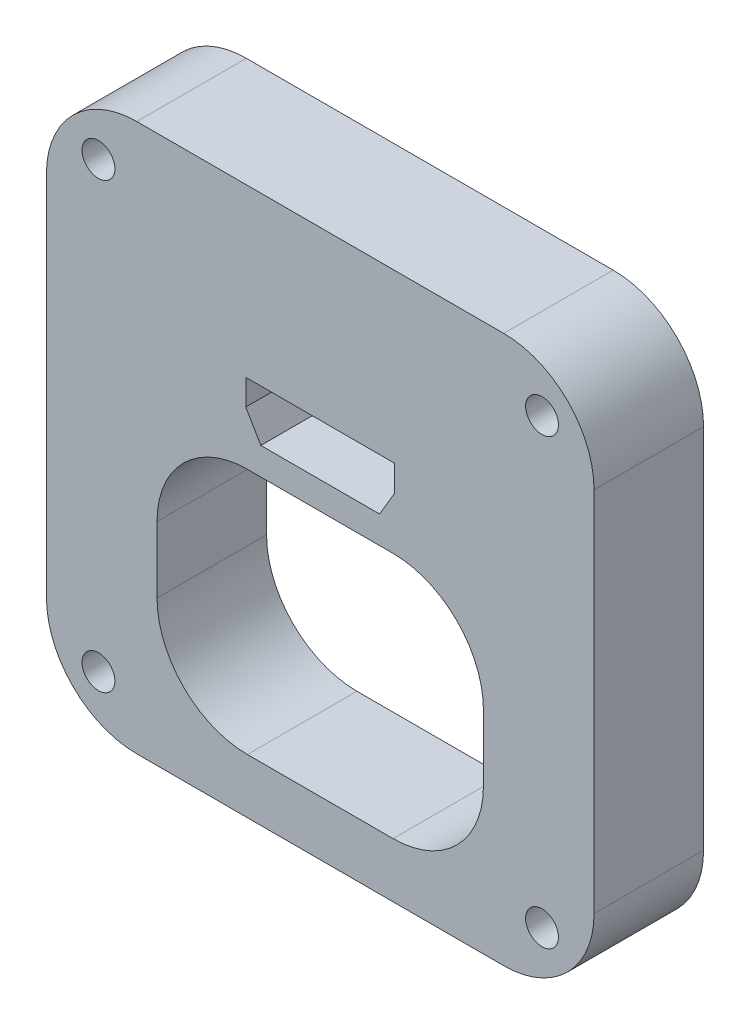
ISO-10303-21;
HEADER;
FILE_DESCRIPTION(('STEP AP214'),'2;1');
FILE_NAME('part.step','',(''),(''),'','','');
FILE_SCHEMA(('AUTOMOTIVE_DESIGN { 1 0 10303 214 1 1 1 1 }'));
ENDSEC;
DATA;
#1=APPLICATION_CONTEXT('core data for automotive mechanical design processes');
#2=APPLICATION_PROTOCOL_DEFINITION('international standard','automotive_design',2000,#1);
#3=PRODUCT_CONTEXT('',#1,'mechanical');
#4=PRODUCT('Part','Part','',(#3));
#5=PRODUCT_RELATED_PRODUCT_CATEGORY('part','',(#4));
#6=PRODUCT_DEFINITION_FORMATION('','',#4);
#7=PRODUCT_DEFINITION_CONTEXT('part definition',#1,'design');
#8=PRODUCT_DEFINITION('design','',#6,#7);
#9=PRODUCT_DEFINITION_SHAPE('','',#8);
#10=(LENGTH_UNIT() NAMED_UNIT(*) SI_UNIT(.MILLI.,.METRE.));
#11=(NAMED_UNIT(*) PLANE_ANGLE_UNIT() SI_UNIT($,.RADIAN.));
#12=(NAMED_UNIT(*) SI_UNIT($,.STERADIAN.) SOLID_ANGLE_UNIT());
#13=UNCERTAINTY_MEASURE_WITH_UNIT(LENGTH_MEASURE(1.E-05),#10,'distance_accuracy_value','');
#14=(GEOMETRIC_REPRESENTATION_CONTEXT(3) GLOBAL_UNCERTAINTY_ASSIGNED_CONTEXT((#13)) GLOBAL_UNIT_ASSIGNED_CONTEXT((#10,
#11,#12)) REPRESENTATION_CONTEXT('',''));
#15=CARTESIAN_POINT('',(0.,0.,0.));
#16=DIRECTION('',(0.,0.,1.));
#17=DIRECTION('',(1.,0.,0.));
#18=AXIS2_PLACEMENT_3D('',#15,#16,#17);
#19=CARTESIAN_POINT('',(8.509,8.509,5.08));
#20=DIRECTION('',(0.,0.,-1.));
#21=DIRECTION('',(-1.,0.,0.));
#22=AXIS2_PLACEMENT_3D('',#19,#20,#21);
#23=PLANE('',#22);
#24=CARTESIAN_POINT('',(10.287,10.287,5.08));
#25=DIRECTION('',(0.,0.,-1.));
#26=DIRECTION('',(-1.,0.,0.));
#27=AXIS2_PLACEMENT_3D('',#24,#25,#26);
#28=CIRCLE('',#27,0.762000000000001);
#29=CARTESIAN_POINT('',(9.52499999999997,10.287,5.08));
#30=VERTEX_POINT('',#29);
#31=EDGE_CURVE('E684',#30,#30,#28,.T.);
#32=ORIENTED_EDGE('',*,*,#31,.T.);
#33=EDGE_LOOP('',(#32));
#34=FACE_BOUND('',#33,.T.);
#35=CARTESIAN_POINT('',(-10.287,-10.287,5.08));
#36=DIRECTION('',(0.,0.,-1.));
#37=DIRECTION('',(-1.,0.,0.));
#38=AXIS2_PLACEMENT_3D('',#35,#36,#37);
#39=CIRCLE('',#38,0.762000000000001);
#40=CARTESIAN_POINT('',(-11.049,-10.287,5.08));
#41=VERTEX_POINT('',#40);
#42=EDGE_CURVE('E299',#41,#41,#39,.T.);
#43=ORIENTED_EDGE('',*,*,#42,.T.);
#44=EDGE_LOOP('',(#43));
#45=FACE_BOUND('',#44,.T.);
#46=DIRECTION('',(1.,0.,0.));
#47=VECTOR('',#46,1.);
#48=CARTESIAN_POINT('',(0.,4.953,5.08));
#49=LINE('',#48,#47);
#50=CARTESIAN_POINT('',(-3.4544,4.953,5.08));
#51=VERTEX_POINT('',#50);
#52=CARTESIAN_POINT('',(3.4544,4.953,5.08));
#53=VERTEX_POINT('',#52);
#54=EDGE_CURVE('E200',#51,#53,#49,.T.);
#55=ORIENTED_EDGE('',*,*,#54,.T.);
#56=DIRECTION('',(0.,-1.,0.));
#57=VECTOR('',#56,1.);
#58=CARTESIAN_POINT('',(3.4544,0.,5.08));
#59=LINE('',#58,#57);
#60=CARTESIAN_POINT('',(3.4544,3.7592,5.08));
#61=VERTEX_POINT('',#60);
#62=EDGE_CURVE('E194',#53,#61,#59,.T.);
#63=ORIENTED_EDGE('',*,*,#62,.T.);
#64=DIRECTION('',(-0.505012393824012,-0.863112091262856,0.));
#65=VECTOR('',#64,1.);
#66=CARTESIAN_POINT('',(0.934829643369024,-0.54697479133294,5.08));
#67=LINE('',#66,#65);
#68=CARTESIAN_POINT('',(2.7559,2.5654,5.08));
#69=VERTEX_POINT('',#68);
#70=EDGE_CURVE('E203',#61,#69,#67,.T.);
#71=ORIENTED_EDGE('',*,*,#70,.T.);
#72=DIRECTION('',(1.,0.,0.));
#73=VECTOR('',#72,1.);
#74=CARTESIAN_POINT('',(0.,2.5654,5.08));
#75=LINE('',#74,#73);
#76=CARTESIAN_POINT('',(-2.7559,2.5654,5.08));
#77=VERTEX_POINT('',#76);
#78=EDGE_CURVE('E208',#77,#69,#75,.T.);
#79=ORIENTED_EDGE('',*,*,#78,.F.);
#80=DIRECTION('',(0.505012393824012,-0.863112091262856,0.));
#81=VECTOR('',#80,1.);
#82=CARTESIAN_POINT('',(-0.934829643369024,-0.54697479133294,5.08));
#83=LINE('',#82,#81);
#84=CARTESIAN_POINT('',(-3.4544,3.7592,5.08));
#85=VERTEX_POINT('',#84);
#86=EDGE_CURVE('E226',#85,#77,#83,.T.);
#87=ORIENTED_EDGE('',*,*,#86,.F.);
#88=DIRECTION('',(0.,-1.,0.));
#89=VECTOR('',#88,1.);
#90=CARTESIAN_POINT('',(-3.4544,0.,5.08));
#91=LINE('',#90,#89);
#92=EDGE_CURVE('E229',#51,#85,#91,.T.);
#93=ORIENTED_EDGE('',*,*,#92,.F.);
#94=EDGE_LOOP('',(#55,#63,#71,#79,#87,#93));
#95=FACE_BOUND('',#94,.T.);
#96=CARTESIAN_POINT('',(8.509,8.509,5.08));
#97=DIRECTION('',(0.,0.,1.));
#98=DIRECTION('',(-1.,0.,0.));
#99=AXIS2_PLACEMENT_3D('',#96,#97,#98);
#100=CIRCLE('',#99,4.191);
#101=CARTESIAN_POINT('',(12.7,8.50899999999997,5.08));
#102=VERTEX_POINT('',#101);
#103=CARTESIAN_POINT('',(8.50899999999997,12.7,5.08));
#104=VERTEX_POINT('',#103);
#105=EDGE_CURVE('E348',#102,#104,#100,.T.);
#106=ORIENTED_EDGE('',*,*,#105,.T.);
#107=DIRECTION('',(-1.,0.,0.));
#108=VECTOR('',#107,1.);
#109=CARTESIAN_POINT('',(-8.50899999999997,12.7,5.08));
#110=LINE('',#109,#108);
#111=CARTESIAN_POINT('',(-8.50899999999997,12.7,5.08));
#112=VERTEX_POINT('',#111);
#113=EDGE_CURVE('E352',#104,#112,#110,.T.);
#114=ORIENTED_EDGE('',*,*,#113,.T.);
#115=CARTESIAN_POINT('',(-8.509,8.509,5.08));
#116=DIRECTION('',(0.,0.,1.));
#117=DIRECTION('',(-1.,0.,0.));
#118=AXIS2_PLACEMENT_3D('',#115,#116,#117);
#119=CIRCLE('',#118,4.191);
#120=CARTESIAN_POINT('',(-12.7,8.50899999999997,5.08));
#121=VERTEX_POINT('',#120);
#122=EDGE_CURVE('E356',#112,#121,#119,.T.);
#123=ORIENTED_EDGE('',*,*,#122,.T.);
#124=DIRECTION('',(0.,-1.,0.));
#125=VECTOR('',#124,1.);
#126=CARTESIAN_POINT('',(-12.7,-8.50899999999997,5.08));
#127=LINE('',#126,#125);
#128=CARTESIAN_POINT('',(-12.7,-8.50899999999997,5.08));
#129=VERTEX_POINT('',#128);
#130=EDGE_CURVE('E359',#121,#129,#127,.T.);
#131=ORIENTED_EDGE('',*,*,#130,.T.);
#132=CARTESIAN_POINT('',(-8.509,-8.509,5.08));
#133=DIRECTION('',(0.,0.,1.));
#134=DIRECTION('',(-1.,0.,0.));
#135=AXIS2_PLACEMENT_3D('',#132,#133,#134);
#136=CIRCLE('',#135,4.191);
#137=CARTESIAN_POINT('',(-8.50899999999997,-12.7,5.08));
#138=VERTEX_POINT('',#137);
#139=EDGE_CURVE('E362',#129,#138,#136,.T.);
#140=ORIENTED_EDGE('',*,*,#139,.T.);
#141=DIRECTION('',(1.,0.,0.));
#142=VECTOR('',#141,1.);
#143=CARTESIAN_POINT('',(-8.50899999999997,-12.7,5.08));
#144=LINE('',#143,#142);
#145=CARTESIAN_POINT('',(8.50899999999997,-12.7,5.08));
#146=VERTEX_POINT('',#145);
#147=EDGE_CURVE('E365',#138,#146,#144,.T.);
#148=ORIENTED_EDGE('',*,*,#147,.T.);
#149=CARTESIAN_POINT('',(8.509,-8.509,5.08));
#150=DIRECTION('',(0.,0.,1.));
#151=DIRECTION('',(-1.,0.,0.));
#152=AXIS2_PLACEMENT_3D('',#149,#150,#151);
#153=CIRCLE('',#152,4.191);
#154=CARTESIAN_POINT('',(12.7,-8.50899999999997,5.08));
#155=VERTEX_POINT('',#154);
#156=EDGE_CURVE('E368',#146,#155,#153,.T.);
#157=ORIENTED_EDGE('',*,*,#156,.T.);
#158=DIRECTION('',(0.,1.,0.));
#159=VECTOR('',#158,1.);
#160=CARTESIAN_POINT('',(12.7,-8.50899999999997,5.08));
#161=LINE('',#160,#159);
#162=EDGE_CURVE('E371',#155,#102,#161,.T.);
#163=ORIENTED_EDGE('',*,*,#162,.T.);
#164=EDGE_LOOP('',(#106,#114,#123,#131,#140,#148,#157,#163));
#165=FACE_BOUND('',#164,.T.);
#166=CARTESIAN_POINT('',(3.3782,-2.8956,5.08));
#167=DIRECTION('',(0.,0.,-1.));
#168=DIRECTION('',(-1.,0.,0.));
#169=AXIS2_PLACEMENT_3D('',#166,#167,#168);
#170=CIRCLE('',#169,4.191);
#171=CARTESIAN_POINT('',(7.5692,-2.89560000000003,5.08));
#172=VERTEX_POINT('',#171);
#173=CARTESIAN_POINT('',(3.37819999999997,1.2954,5.08));
#174=VERTEX_POINT('',#173);
#175=EDGE_CURVE('E266',#172,#174,#170,.F.);
#176=ORIENTED_EDGE('',*,*,#175,.F.);
#177=DIRECTION('',(0.,-1.,0.));
#178=VECTOR('',#177,1.);
#179=CARTESIAN_POINT('',(7.5692,0.,5.08));
#180=LINE('',#179,#178);
#181=CARTESIAN_POINT('',(7.5692,-5.96899999999997,5.08));
#182=VERTEX_POINT('',#181);
#183=EDGE_CURVE('E269',#172,#182,#180,.T.);
#184=ORIENTED_EDGE('',*,*,#183,.T.);
#185=CARTESIAN_POINT('',(3.3782,-5.969,5.08));
#186=DIRECTION('',(0.,0.,-1.));
#187=DIRECTION('',(-1.,0.,0.));
#188=AXIS2_PLACEMENT_3D('',#185,#186,#187);
#189=CIRCLE('',#188,4.191);
#190=CARTESIAN_POINT('',(3.37819999999997,-10.16,5.08));
#191=VERTEX_POINT('',#190);
#192=EDGE_CURVE('E274',#191,#182,#189,.F.);
#193=ORIENTED_EDGE('',*,*,#192,.F.);
#194=DIRECTION('',(1.,0.,0.));
#195=VECTOR('',#194,1.);
#196=CARTESIAN_POINT('',(0.,-10.16,5.08));
#197=LINE('',#196,#195);
#198=CARTESIAN_POINT('',(-3.37819999999997,-10.16,5.08));
#199=VERTEX_POINT('',#198);
#200=EDGE_CURVE('E277',#199,#191,#197,.T.);
#201=ORIENTED_EDGE('',*,*,#200,.F.);
#202=CARTESIAN_POINT('',(-3.3782,-5.969,5.08));
#203=DIRECTION('',(0.,0.,-1.));
#204=DIRECTION('',(-1.,0.,0.));
#205=AXIS2_PLACEMENT_3D('',#202,#203,#204);
#206=CIRCLE('',#205,4.191);
#207=CARTESIAN_POINT('',(-7.5692,-5.96899999999997,5.08));
#208=VERTEX_POINT('',#207);
#209=EDGE_CURVE('E280',#208,#199,#206,.F.);
#210=ORIENTED_EDGE('',*,*,#209,.F.);
#211=DIRECTION('',(0.,-1.,0.));
#212=VECTOR('',#211,1.);
#213=CARTESIAN_POINT('',(-7.5692,0.,5.08));
#214=LINE('',#213,#212);
#215=CARTESIAN_POINT('',(-7.5692,-2.89560000000003,5.08));
#216=VERTEX_POINT('',#215);
#217=EDGE_CURVE('E283',#216,#208,#214,.T.);
#218=ORIENTED_EDGE('',*,*,#217,.F.);
#219=CARTESIAN_POINT('',(-3.3782,-2.8956,5.08));
#220=DIRECTION('',(0.,0.,-1.));
#221=DIRECTION('',(-1.,0.,0.));
#222=AXIS2_PLACEMENT_3D('',#219,#220,#221);
#223=CIRCLE('',#222,4.191);
#224=CARTESIAN_POINT('',(-3.37819999999997,1.2954,5.08));
#225=VERTEX_POINT('',#224);
#226=EDGE_CURVE('E286',#216,#225,#223,.T.);
#227=ORIENTED_EDGE('',*,*,#226,.T.);
#228=DIRECTION('',(-1.,0.,0.));
#229=VECTOR('',#228,1.);
#230=CARTESIAN_POINT('',(0.,1.2954,5.08));
#231=LINE('',#230,#229);
#232=EDGE_CURVE('E290',#174,#225,#231,.T.);
#233=ORIENTED_EDGE('',*,*,#232,.F.);
#234=EDGE_LOOP('',(#176,#184,#193,#201,#210,#218,#227,#233));
#235=FACE_BOUND('',#234,.T.);
#236=CARTESIAN_POINT('',(10.287,-10.287,5.08));
#237=DIRECTION('',(0.,0.,-1.));
#238=DIRECTION('',(-1.,0.,0.));
#239=AXIS2_PLACEMENT_3D('',#236,#237,#238);
#240=CIRCLE('',#239,0.762000000000001);
#241=CARTESIAN_POINT('',(9.52499999999997,-10.287,5.08));
#242=VERTEX_POINT('',#241);
#243=EDGE_CURVE('E702',#242,#242,#240,.F.);
#244=ORIENTED_EDGE('',*,*,#243,.F.);
#245=EDGE_LOOP('',(#244));
#246=FACE_BOUND('',#245,.T.);
#247=CARTESIAN_POINT('',(-10.287,10.287,5.08));
#248=DIRECTION('',(0.,0.,1.));
#249=DIRECTION('',(1.,0.,0.));
#250=AXIS2_PLACEMENT_3D('',#247,#248,#249);
#251=CIRCLE('',#250,0.762000000000001);
#252=CARTESIAN_POINT('',(-9.52499999999997,10.287,5.08));
#253=VERTEX_POINT('',#252);
#254=EDGE_CURVE('E678',#253,#253,#251,.T.);
#255=ORIENTED_EDGE('',*,*,#254,.F.);
#256=EDGE_LOOP('',(#255));
#257=FACE_BOUND('',#256,.T.);
#258=ADVANCED_FACE('F39',(#34,#45,#95,#165,#235,#246,#257),#23,.F.);
#259=CARTESIAN_POINT('',(8.509,8.509,0.));
#260=DIRECTION('',(0.,0.,-1.));
#261=DIRECTION('',(-1.,0.,0.));
#262=AXIS2_PLACEMENT_3D('',#259,#260,#261);
#263=PLANE('',#262);
#264=CARTESIAN_POINT('',(10.287,-10.287,0.));
#265=DIRECTION('',(0.,0.,-1.));
#266=DIRECTION('',(-1.,0.,0.));
#267=AXIS2_PLACEMENT_3D('',#264,#265,#266);
#268=CIRCLE('',#267,0.762000000000001);
#269=CARTESIAN_POINT('',(9.52499999999997,-10.287,0.));
#270=VERTEX_POINT('',#269);
#271=EDGE_CURVE('E697',#270,#270,#268,.F.);
#272=ORIENTED_EDGE('',*,*,#271,.T.);
#273=EDGE_LOOP('',(#272));
#274=FACE_BOUND('',#273,.T.);
#275=CARTESIAN_POINT('',(-10.287,-10.287,0.));
#276=DIRECTION('',(0.,0.,-1.));
#277=DIRECTION('',(-1.,0.,0.));
#278=AXIS2_PLACEMENT_3D('',#275,#276,#277);
#279=CIRCLE('',#278,0.762000000000001);
#280=CARTESIAN_POINT('',(-11.049,-10.287,0.));
#281=VERTEX_POINT('',#280);
#282=EDGE_CURVE('E221',#281,#281,#279,.T.);
#283=ORIENTED_EDGE('',*,*,#282,.F.);
#284=EDGE_LOOP('',(#283));
#285=FACE_BOUND('',#284,.T.);
#286=DIRECTION('',(0.,-1.,0.));
#287=VECTOR('',#286,1.);
#288=CARTESIAN_POINT('',(3.4544,0.,0.));
#289=LINE('',#288,#287);
#290=CARTESIAN_POINT('',(3.4544,4.953,0.));
#291=VERTEX_POINT('',#290);
#292=CARTESIAN_POINT('',(3.4544,3.7592,0.));
#293=VERTEX_POINT('',#292);
#294=EDGE_CURVE('E197',#291,#293,#289,.T.);
#295=ORIENTED_EDGE('',*,*,#294,.F.);
#296=DIRECTION('',(1.,0.,0.));
#297=VECTOR('',#296,1.);
#298=CARTESIAN_POINT('',(0.,4.953,0.));
#299=LINE('',#298,#297);
#300=CARTESIAN_POINT('',(-3.4544,4.953,0.));
#301=VERTEX_POINT('',#300);
#302=EDGE_CURVE('E214',#301,#291,#299,.T.);
#303=ORIENTED_EDGE('',*,*,#302,.F.);
#304=DIRECTION('',(0.,-1.,0.));
#305=VECTOR('',#304,1.);
#306=CARTESIAN_POINT('',(-3.4544,0.,0.));
#307=LINE('',#306,#305);
#308=CARTESIAN_POINT('',(-3.4544,3.7592,0.));
#309=VERTEX_POINT('',#308);
#310=EDGE_CURVE('E218',#301,#309,#307,.T.);
#311=ORIENTED_EDGE('',*,*,#310,.T.);
#312=DIRECTION('',(0.505012393824012,-0.863112091262856,0.));
#313=VECTOR('',#312,1.);
#314=CARTESIAN_POINT('',(-0.934829643369024,-0.54697479133294,0.));
#315=LINE('',#314,#313);
#316=CARTESIAN_POINT('',(-2.7559,2.5654,0.));
#317=VERTEX_POINT('',#316);
#318=EDGE_CURVE('E244',#309,#317,#315,.T.);
#319=ORIENTED_EDGE('',*,*,#318,.T.);
#320=DIRECTION('',(1.,0.,0.));
#321=VECTOR('',#320,1.);
#322=CARTESIAN_POINT('',(0.,2.5654,0.));
#323=LINE('',#322,#321);
#324=CARTESIAN_POINT('',(2.7559,2.5654,0.));
#325=VERTEX_POINT('',#324);
#326=EDGE_CURVE('E240',#317,#325,#323,.T.);
#327=ORIENTED_EDGE('',*,*,#326,.T.);
#328=DIRECTION('',(-0.505012393824012,-0.863112091262856,0.));
#329=VECTOR('',#328,1.);
#330=CARTESIAN_POINT('',(0.934829643369024,-0.54697479133294,0.));
#331=LINE('',#330,#329);
#332=EDGE_CURVE('E236',#293,#325,#331,.T.);
#333=ORIENTED_EDGE('',*,*,#332,.F.);
#334=EDGE_LOOP('',(#295,#303,#311,#319,#327,#333));
#335=FACE_BOUND('',#334,.T.);
#336=CARTESIAN_POINT('',(8.509,8.509,0.));
#337=DIRECTION('',(0.,0.,1.));
#338=DIRECTION('',(-1.,0.,0.));
#339=AXIS2_PLACEMENT_3D('',#336,#337,#338);
#340=CIRCLE('',#339,4.191);
#341=CARTESIAN_POINT('',(12.7,8.50899999999997,0.));
#342=VERTEX_POINT('',#341);
#343=CARTESIAN_POINT('',(8.50899999999997,12.7,0.));
#344=VERTEX_POINT('',#343);
#345=EDGE_CURVE('E254',#342,#344,#340,.T.);
#346=ORIENTED_EDGE('',*,*,#345,.F.);
#347=DIRECTION('',(0.,1.,0.));
#348=VECTOR('',#347,1.);
#349=CARTESIAN_POINT('',(12.7,-8.50899999999997,0.));
#350=LINE('',#349,#348);
#351=CARTESIAN_POINT('',(12.7,-8.50899999999997,0.));
#352=VERTEX_POINT('',#351);
#353=EDGE_CURVE('E353',#352,#342,#350,.T.);
#354=ORIENTED_EDGE('',*,*,#353,.F.);
#355=CARTESIAN_POINT('',(8.509,-8.509,0.));
#356=DIRECTION('',(0.,0.,1.));
#357=DIRECTION('',(-1.,0.,0.));
#358=AXIS2_PLACEMENT_3D('',#355,#356,#357);
#359=CIRCLE('',#358,4.191);
#360=CARTESIAN_POINT('',(8.50899999999997,-12.7,0.));
#361=VERTEX_POINT('',#360);
#362=EDGE_CURVE('E393',#361,#352,#359,.T.);
#363=ORIENTED_EDGE('',*,*,#362,.F.);
#364=DIRECTION('',(1.,0.,0.));
#365=VECTOR('',#364,1.);
#366=CARTESIAN_POINT('',(-8.50899999999997,-12.7,0.));
#367=LINE('',#366,#365);
#368=CARTESIAN_POINT('',(-8.50899999999997,-12.7,0.));
#369=VERTEX_POINT('',#368);
#370=EDGE_CURVE('E390',#369,#361,#367,.T.);
#371=ORIENTED_EDGE('',*,*,#370,.F.);
#372=CARTESIAN_POINT('',(-8.509,-8.509,0.));
#373=DIRECTION('',(0.,0.,1.));
#374=DIRECTION('',(-1.,0.,0.));
#375=AXIS2_PLACEMENT_3D('',#372,#373,#374);
#376=CIRCLE('',#375,4.191);
#377=CARTESIAN_POINT('',(-12.7,-8.50899999999997,0.));
#378=VERTEX_POINT('',#377);
#379=EDGE_CURVE('E387',#378,#369,#376,.T.);
#380=ORIENTED_EDGE('',*,*,#379,.F.);
#381=DIRECTION('',(0.,-1.,0.));
#382=VECTOR('',#381,1.);
#383=CARTESIAN_POINT('',(-12.7,-8.50899999999997,0.));
#384=LINE('',#383,#382);
#385=CARTESIAN_POINT('',(-12.7,8.50899999999997,0.));
#386=VERTEX_POINT('',#385);
#387=EDGE_CURVE('E384',#386,#378,#384,.T.);
#388=ORIENTED_EDGE('',*,*,#387,.F.);
#389=CARTESIAN_POINT('',(-8.509,8.509,0.));
#390=DIRECTION('',(0.,0.,1.));
#391=DIRECTION('',(-1.,0.,0.));
#392=AXIS2_PLACEMENT_3D('',#389,#390,#391);
#393=CIRCLE('',#392,4.191);
#394=CARTESIAN_POINT('',(-8.50899999999997,12.7,0.));
#395=VERTEX_POINT('',#394);
#396=EDGE_CURVE('E381',#395,#386,#393,.T.);
#397=ORIENTED_EDGE('',*,*,#396,.F.);
#398=DIRECTION('',(-1.,0.,0.));
#399=VECTOR('',#398,1.);
#400=CARTESIAN_POINT('',(-8.50899999999997,12.7,0.));
#401=LINE('',#400,#399);
#402=EDGE_CURVE('E378',#344,#395,#401,.T.);
#403=ORIENTED_EDGE('',*,*,#402,.F.);
#404=EDGE_LOOP('',(#346,#354,#363,#371,#380,#388,#397,#403));
#405=FACE_BOUND('',#404,.T.);
#406=DIRECTION('',(0.,-1.,0.));
#407=VECTOR('',#406,1.);
#408=CARTESIAN_POINT('',(7.5692,0.,0.));
#409=LINE('',#408,#407);
#410=CARTESIAN_POINT('',(7.5692,-2.89560000000003,0.));
#411=VERTEX_POINT('',#410);
#412=CARTESIAN_POINT('',(7.5692,-5.96899999999997,0.));
#413=VERTEX_POINT('',#412);
#414=EDGE_CURVE('E298',#411,#413,#409,.T.);
#415=ORIENTED_EDGE('',*,*,#414,.F.);
#416=CARTESIAN_POINT('',(3.3782,-2.8956,0.));
#417=DIRECTION('',(0.,0.,-1.));
#418=DIRECTION('',(-1.,0.,0.));
#419=AXIS2_PLACEMENT_3D('',#416,#417,#418);
#420=CIRCLE('',#419,4.191);
#421=CARTESIAN_POINT('',(3.37819999999997,1.2954,0.));
#422=VERTEX_POINT('',#421);
#423=EDGE_CURVE('E294',#411,#422,#420,.F.);
#424=ORIENTED_EDGE('',*,*,#423,.T.);
#425=DIRECTION('',(-1.,0.,0.));
#426=VECTOR('',#425,1.);
#427=CARTESIAN_POINT('',(0.,1.2954,0.));
#428=LINE('',#427,#426);
#429=CARTESIAN_POINT('',(-3.37819999999997,1.2954,0.));
#430=VERTEX_POINT('',#429);
#431=EDGE_CURVE('E270',#422,#430,#428,.T.);
#432=ORIENTED_EDGE('',*,*,#431,.T.);
#433=CARTESIAN_POINT('',(-3.3782,-2.8956,0.));
#434=DIRECTION('',(0.,0.,-1.));
#435=DIRECTION('',(-1.,0.,0.));
#436=AXIS2_PLACEMENT_3D('',#433,#434,#435);
#437=CIRCLE('',#436,4.191);
#438=CARTESIAN_POINT('',(-7.5692,-2.89560000000003,0.));
#439=VERTEX_POINT('',#438);
#440=EDGE_CURVE('E318',#439,#430,#437,.T.);
#441=ORIENTED_EDGE('',*,*,#440,.F.);
#442=DIRECTION('',(0.,-1.,0.));
#443=VECTOR('',#442,1.);
#444=CARTESIAN_POINT('',(-7.5692,0.,0.));
#445=LINE('',#444,#443);
#446=CARTESIAN_POINT('',(-7.5692,-5.96899999999997,0.));
#447=VERTEX_POINT('',#446);
#448=EDGE_CURVE('E314',#439,#447,#445,.T.);
#449=ORIENTED_EDGE('',*,*,#448,.T.);
#450=CARTESIAN_POINT('',(-3.3782,-5.969,0.));
#451=DIRECTION('',(0.,0.,-1.));
#452=DIRECTION('',(-1.,0.,0.));
#453=AXIS2_PLACEMENT_3D('',#450,#451,#452);
#454=CIRCLE('',#453,4.191);
#455=CARTESIAN_POINT('',(-3.37819999999997,-10.16,0.));
#456=VERTEX_POINT('',#455);
#457=EDGE_CURVE('E310',#447,#456,#454,.F.);
#458=ORIENTED_EDGE('',*,*,#457,.T.);
#459=DIRECTION('',(1.,0.,0.));
#460=VECTOR('',#459,1.);
#461=CARTESIAN_POINT('',(0.,-10.16,0.));
#462=LINE('',#461,#460);
#463=CARTESIAN_POINT('',(3.37819999999997,-10.16,0.));
#464=VERTEX_POINT('',#463);
#465=EDGE_CURVE('E306',#456,#464,#462,.T.);
#466=ORIENTED_EDGE('',*,*,#465,.T.);
#467=CARTESIAN_POINT('',(3.3782,-5.969,0.));
#468=DIRECTION('',(0.,0.,-1.));
#469=DIRECTION('',(-1.,0.,0.));
#470=AXIS2_PLACEMENT_3D('',#467,#468,#469);
#471=CIRCLE('',#470,4.191);
#472=EDGE_CURVE('E302',#464,#413,#471,.F.);
#473=ORIENTED_EDGE('',*,*,#472,.T.);
#474=EDGE_LOOP('',(#415,#424,#432,#441,#449,#458,#466,#473));
#475=FACE_BOUND('',#474,.T.);
#476=CARTESIAN_POINT('',(10.287,10.287,0.));
#477=DIRECTION('',(0.,0.,-1.));
#478=DIRECTION('',(-1.,0.,0.));
#479=AXIS2_PLACEMENT_3D('',#476,#477,#478);
#480=CIRCLE('',#479,0.762000000000001);
#481=CARTESIAN_POINT('',(9.52499999999997,10.287,0.));
#482=VERTEX_POINT('',#481);
#483=EDGE_CURVE('E688',#482,#482,#480,.T.);
#484=ORIENTED_EDGE('',*,*,#483,.F.);
#485=EDGE_LOOP('',(#484));
#486=FACE_BOUND('',#485,.T.);
#487=CARTESIAN_POINT('',(-10.287,10.287,0.));
#488=DIRECTION('',(0.,0.,1.));
#489=DIRECTION('',(1.,0.,0.));
#490=AXIS2_PLACEMENT_3D('',#487,#488,#489);
#491=CIRCLE('',#490,0.762000000000001);
#492=CARTESIAN_POINT('',(-9.52499999999997,10.287,0.));
#493=VERTEX_POINT('',#492);
#494=EDGE_CURVE('E681',#493,#493,#491,.T.);
#495=ORIENTED_EDGE('',*,*,#494,.T.);
#496=EDGE_LOOP('',(#495));
#497=FACE_BOUND('',#496,.T.);
#498=ADVANCED_FACE('F432',(#274,#285,#335,#405,#475,#486,#497),#263,.T.);
#499=CARTESIAN_POINT('',(8.509,8.509,5.08));
#500=DIRECTION('',(0.,0.,-1.));
#501=DIRECTION('',(-1.,0.,0.));
#502=AXIS2_PLACEMENT_3D('',#499,#500,#501);
#503=CYLINDRICAL_SURFACE('',#502,4.191);
#504=ORIENTED_EDGE('',*,*,#345,.T.);
#505=DIRECTION('',(0.,0.,-1.));
#506=VECTOR('',#505,1.);
#507=CARTESIAN_POINT('',(8.50899999999997,12.7,5.08));
#508=LINE('',#507,#506);
#509=EDGE_CURVE('E11',#104,#344,#508,.T.);
#510=ORIENTED_EDGE('',*,*,#509,.F.);
#511=ORIENTED_EDGE('',*,*,#105,.F.);
#512=DIRECTION('',(0.,0.,-1.));
#513=VECTOR('',#512,1.);
#514=CARTESIAN_POINT('',(12.7,8.50899999999997,5.08));
#515=LINE('',#514,#513);
#516=EDGE_CURVE('E374',#102,#342,#515,.T.);
#517=ORIENTED_EDGE('',*,*,#516,.T.);
#518=EDGE_LOOP('',(#504,#510,#511,#517));
#519=FACE_BOUND('',#518,.T.);
#520=ADVANCED_FACE('F41',(#519),#503,.T.);
#521=CARTESIAN_POINT('',(-8.50899999999997,12.7,5.08));
#522=DIRECTION('',(0.,-1.,0.));
#523=DIRECTION('',(0.,0.,-1.));
#524=AXIS2_PLACEMENT_3D('',#521,#522,#523);
#525=PLANE('',#524);
#526=ORIENTED_EDGE('',*,*,#402,.T.);
#527=DIRECTION('',(0.,0.,-1.));
#528=VECTOR('',#527,1.);
#529=CARTESIAN_POINT('',(-8.50899999999997,12.7,5.08));
#530=LINE('',#529,#528);
#531=EDGE_CURVE('E48',#112,#395,#530,.T.);
#532=ORIENTED_EDGE('',*,*,#531,.F.);
#533=ORIENTED_EDGE('',*,*,#113,.F.);
#534=ORIENTED_EDGE('',*,*,#509,.T.);
#535=EDGE_LOOP('',(#526,#532,#533,#534));
#536=FACE_BOUND('',#535,.T.);
#537=ADVANCED_FACE('F449',(#536),#525,.F.);
#538=CARTESIAN_POINT('',(-8.509,8.509,5.08));
#539=DIRECTION('',(0.,0.,-1.));
#540=DIRECTION('',(-1.,0.,0.));
#541=AXIS2_PLACEMENT_3D('',#538,#539,#540);
#542=CYLINDRICAL_SURFACE('',#541,4.191);
#543=ORIENTED_EDGE('',*,*,#396,.T.);
#544=DIRECTION('',(0.,0.,-1.));
#545=VECTOR('',#544,1.);
#546=CARTESIAN_POINT('',(-12.7,8.50899999999997,5.08));
#547=LINE('',#546,#545);
#548=EDGE_CURVE('E417',#121,#386,#547,.T.);
#549=ORIENTED_EDGE('',*,*,#548,.F.);
#550=ORIENTED_EDGE('',*,*,#122,.F.);
#551=ORIENTED_EDGE('',*,*,#531,.T.);
#552=EDGE_LOOP('',(#543,#549,#550,#551));
#553=FACE_BOUND('',#552,.T.);
#554=ADVANCED_FACE('F426',(#553),#542,.T.);
#555=CARTESIAN_POINT('',(-12.7,-8.50899999999997,5.08));
#556=DIRECTION('',(1.,0.,0.));
#557=DIRECTION('',(0.,0.,-1.));
#558=AXIS2_PLACEMENT_3D('',#555,#556,#557);
#559=PLANE('',#558);
#560=ORIENTED_EDGE('',*,*,#387,.T.);
#561=DIRECTION('',(0.,0.,-1.));
#562=VECTOR('',#561,1.);
#563=CARTESIAN_POINT('',(-12.7,-8.50899999999997,5.08));
#564=LINE('',#563,#562);
#565=EDGE_CURVE('E413',#129,#378,#564,.T.);
#566=ORIENTED_EDGE('',*,*,#565,.F.);
#567=ORIENTED_EDGE('',*,*,#130,.F.);
#568=ORIENTED_EDGE('',*,*,#548,.T.);
#569=EDGE_LOOP('',(#560,#566,#567,#568));
#570=FACE_BOUND('',#569,.T.);
#571=ADVANCED_FACE('F438',(#570),#559,.F.);
#572=CARTESIAN_POINT('',(-8.509,-8.509,5.08));
#573=DIRECTION('',(0.,0.,-1.));
#574=DIRECTION('',(-1.,0.,0.));
#575=AXIS2_PLACEMENT_3D('',#572,#573,#574);
#576=CYLINDRICAL_SURFACE('',#575,4.191);
#577=ORIENTED_EDGE('',*,*,#379,.T.);
#578=DIRECTION('',(0.,0.,-1.));
#579=VECTOR('',#578,1.);
#580=CARTESIAN_POINT('',(-8.50899999999997,-12.7,5.08));
#581=LINE('',#580,#579);
#582=EDGE_CURVE('E409',#138,#369,#581,.T.);
#583=ORIENTED_EDGE('',*,*,#582,.F.);
#584=ORIENTED_EDGE('',*,*,#139,.F.);
#585=ORIENTED_EDGE('',*,*,#565,.T.);
#586=EDGE_LOOP('',(#577,#583,#584,#585));
#587=FACE_BOUND('',#586,.T.);
#588=ADVANCED_FACE('F442',(#587),#576,.T.);
#589=CARTESIAN_POINT('',(-8.50899999999997,-12.7,5.08));
#590=DIRECTION('',(0.,1.,0.));
#591=DIRECTION('',(0.,0.,1.));
#592=AXIS2_PLACEMENT_3D('',#589,#590,#591);
#593=PLANE('',#592);
#594=ORIENTED_EDGE('',*,*,#370,.T.);
#595=DIRECTION('',(0.,0.,-1.));
#596=VECTOR('',#595,1.);
#597=CARTESIAN_POINT('',(8.50899999999997,-12.7,5.08));
#598=LINE('',#597,#596);
#599=EDGE_CURVE('E405',#146,#361,#598,.T.);
#600=ORIENTED_EDGE('',*,*,#599,.F.);
#601=ORIENTED_EDGE('',*,*,#147,.F.);
#602=ORIENTED_EDGE('',*,*,#582,.T.);
#603=EDGE_LOOP('',(#594,#600,#601,#602));
#604=FACE_BOUND('',#603,.T.);
#605=ADVANCED_FACE('F462',(#604),#593,.F.);
#606=CARTESIAN_POINT('',(8.509,-8.509,5.08));
#607=DIRECTION('',(0.,0.,-1.));
#608=DIRECTION('',(-1.,0.,0.));
#609=AXIS2_PLACEMENT_3D('',#606,#607,#608);
#610=CYLINDRICAL_SURFACE('',#609,4.191);
#611=ORIENTED_EDGE('',*,*,#362,.T.);
#612=DIRECTION('',(0.,0.,-1.));
#613=VECTOR('',#612,1.);
#614=CARTESIAN_POINT('',(12.7,-8.50899999999997,5.08));
#615=LINE('',#614,#613);
#616=EDGE_CURVE('E401',#155,#352,#615,.T.);
#617=ORIENTED_EDGE('',*,*,#616,.F.);
#618=ORIENTED_EDGE('',*,*,#156,.F.);
#619=ORIENTED_EDGE('',*,*,#599,.T.);
#620=EDGE_LOOP('',(#611,#617,#618,#619));
#621=FACE_BOUND('',#620,.T.);
#622=ADVANCED_FACE('F460',(#621),#610,.T.);
#623=CARTESIAN_POINT('',(12.7,-8.50899999999997,5.08));
#624=DIRECTION('',(-1.,0.,0.));
#625=DIRECTION('',(0.,0.,1.));
#626=AXIS2_PLACEMENT_3D('',#623,#624,#625);
#627=PLANE('',#626);
#628=ORIENTED_EDGE('',*,*,#353,.T.);
#629=ORIENTED_EDGE('',*,*,#516,.F.);
#630=ORIENTED_EDGE('',*,*,#162,.F.);
#631=ORIENTED_EDGE('',*,*,#616,.T.);
#632=EDGE_LOOP('',(#628,#629,#630,#631));
#633=FACE_BOUND('',#632,.T.);
#634=ADVANCED_FACE('F455',(#633),#627,.F.);
#635=CARTESIAN_POINT('',(3.3782,-2.8956,5.08));
#636=DIRECTION('',(0.,0.,-1.));
#637=DIRECTION('',(-1.,0.,0.));
#638=AXIS2_PLACEMENT_3D('',#635,#636,#637);
#639=CYLINDRICAL_SURFACE('',#638,4.191);
#640=ORIENTED_EDGE('',*,*,#423,.F.);
#641=DIRECTION('',(0.,0.,-1.));
#642=VECTOR('',#641,1.);
#643=CARTESIAN_POINT('',(7.5692,-2.89560000000003,5.08));
#644=LINE('',#643,#642);
#645=EDGE_CURVE('E293',#172,#411,#644,.T.);
#646=ORIENTED_EDGE('',*,*,#645,.F.);
#647=ORIENTED_EDGE('',*,*,#175,.T.);
#648=DIRECTION('',(0.,0.,-1.));
#649=VECTOR('',#648,1.);
#650=CARTESIAN_POINT('',(3.37819999999997,1.2954,5.08));
#651=LINE('',#650,#649);
#652=EDGE_CURVE('E237',#174,#422,#651,.T.);
#653=ORIENTED_EDGE('',*,*,#652,.T.);
#654=EDGE_LOOP('',(#640,#646,#647,#653));
#655=FACE_BOUND('',#654,.T.);
#656=ADVANCED_FACE('F482',(#655),#639,.F.);
#657=CARTESIAN_POINT('',(0.,1.2954,5.08));
#658=DIRECTION('',(0.,-1.,0.));
#659=DIRECTION('',(0.,0.,-1.));
#660=AXIS2_PLACEMENT_3D('',#657,#658,#659);
#661=PLANE('',#660);
#662=ORIENTED_EDGE('',*,*,#431,.F.);
#663=ORIENTED_EDGE('',*,*,#652,.F.);
#664=ORIENTED_EDGE('',*,*,#232,.T.);
#665=DIRECTION('',(0.,0.,-1.));
#666=VECTOR('',#665,1.);
#667=CARTESIAN_POINT('',(-3.37819999999997,1.2954,5.08));
#668=LINE('',#667,#666);
#669=EDGE_CURVE('E328',#225,#430,#668,.T.);
#670=ORIENTED_EDGE('',*,*,#669,.T.);
#671=EDGE_LOOP('',(#662,#663,#664,#670));
#672=FACE_BOUND('',#671,.T.);
#673=ADVANCED_FACE('F489',(#672),#661,.T.);
#674=CARTESIAN_POINT('',(-3.3782,-2.8956,5.08));
#675=DIRECTION('',(0.,0.,-1.));
#676=DIRECTION('',(-1.,0.,0.));
#677=AXIS2_PLACEMENT_3D('',#674,#675,#676);
#678=CYLINDRICAL_SURFACE('',#677,4.191);
#679=ORIENTED_EDGE('',*,*,#440,.T.);
#680=ORIENTED_EDGE('',*,*,#669,.F.);
#681=ORIENTED_EDGE('',*,*,#226,.F.);
#682=DIRECTION('',(0.,0.,-1.));
#683=VECTOR('',#682,1.);
#684=CARTESIAN_POINT('',(-7.5692,-2.89560000000003,5.08));
#685=LINE('',#684,#683);
#686=EDGE_CURVE('E331',#216,#439,#685,.T.);
#687=ORIENTED_EDGE('',*,*,#686,.T.);
#688=EDGE_LOOP('',(#679,#680,#681,#687));
#689=FACE_BOUND('',#688,.T.);
#690=ADVANCED_FACE('F494',(#689),#678,.F.);
#691=CARTESIAN_POINT('',(-7.5692,0.,5.08));
#692=DIRECTION('',(1.,0.,0.));
#693=DIRECTION('',(0.,0.,-1.));
#694=AXIS2_PLACEMENT_3D('',#691,#692,#693);
#695=PLANE('',#694);
#696=ORIENTED_EDGE('',*,*,#448,.F.);
#697=ORIENTED_EDGE('',*,*,#686,.F.);
#698=ORIENTED_EDGE('',*,*,#217,.T.);
#699=DIRECTION('',(0.,0.,-1.));
#700=VECTOR('',#699,1.);
#701=CARTESIAN_POINT('',(-7.5692,-5.96899999999997,5.08));
#702=LINE('',#701,#700);
#703=EDGE_CURVE('E334',#208,#447,#702,.T.);
#704=ORIENTED_EDGE('',*,*,#703,.T.);
#705=EDGE_LOOP('',(#696,#697,#698,#704));
#706=FACE_BOUND('',#705,.T.);
#707=ADVANCED_FACE('F518',(#706),#695,.T.);
#708=CARTESIAN_POINT('',(-3.3782,-5.969,5.08));
#709=DIRECTION('',(0.,0.,-1.));
#710=DIRECTION('',(-1.,0.,0.));
#711=AXIS2_PLACEMENT_3D('',#708,#709,#710);
#712=CYLINDRICAL_SURFACE('',#711,4.191);
#713=ORIENTED_EDGE('',*,*,#457,.F.);
#714=ORIENTED_EDGE('',*,*,#703,.F.);
#715=ORIENTED_EDGE('',*,*,#209,.T.);
#716=DIRECTION('',(0.,0.,-1.));
#717=VECTOR('',#716,1.);
#718=CARTESIAN_POINT('',(-3.37819999999997,-10.16,5.08));
#719=LINE('',#718,#717);
#720=EDGE_CURVE('E337',#199,#456,#719,.T.);
#721=ORIENTED_EDGE('',*,*,#720,.T.);
#722=EDGE_LOOP('',(#713,#714,#715,#721));
#723=FACE_BOUND('',#722,.T.);
#724=ADVANCED_FACE('F523',(#723),#712,.F.);
#725=CARTESIAN_POINT('',(0.,-10.16,5.08));
#726=DIRECTION('',(0.,1.,0.));
#727=DIRECTION('',(0.,0.,1.));
#728=AXIS2_PLACEMENT_3D('',#725,#726,#727);
#729=PLANE('',#728);
#730=ORIENTED_EDGE('',*,*,#465,.F.);
#731=ORIENTED_EDGE('',*,*,#720,.F.);
#732=ORIENTED_EDGE('',*,*,#200,.T.);
#733=DIRECTION('',(0.,0.,-1.));
#734=VECTOR('',#733,1.);
#735=CARTESIAN_POINT('',(3.37819999999997,-10.16,5.08));
#736=LINE('',#735,#734);
#737=EDGE_CURVE('E340',#191,#464,#736,.T.);
#738=ORIENTED_EDGE('',*,*,#737,.T.);
#739=EDGE_LOOP('',(#730,#731,#732,#738));
#740=FACE_BOUND('',#739,.T.);
#741=ADVANCED_FACE('F526',(#740),#729,.T.);
#742=CARTESIAN_POINT('',(3.3782,-5.969,5.08));
#743=DIRECTION('',(0.,0.,-1.));
#744=DIRECTION('',(-1.,0.,0.));
#745=AXIS2_PLACEMENT_3D('',#742,#743,#744);
#746=CYLINDRICAL_SURFACE('',#745,4.191);
#747=ORIENTED_EDGE('',*,*,#472,.F.);
#748=ORIENTED_EDGE('',*,*,#737,.F.);
#749=ORIENTED_EDGE('',*,*,#192,.T.);
#750=DIRECTION('',(0.,0.,-1.));
#751=VECTOR('',#750,1.);
#752=CARTESIAN_POINT('',(7.5692,-5.96899999999997,5.08));
#753=LINE('',#752,#751);
#754=EDGE_CURVE('E63',#182,#413,#753,.T.);
#755=ORIENTED_EDGE('',*,*,#754,.T.);
#756=EDGE_LOOP('',(#747,#748,#749,#755));
#757=FACE_BOUND('',#756,.T.);
#758=ADVANCED_FACE('F506',(#757),#746,.F.);
#759=CARTESIAN_POINT('',(7.5692,0.,5.08));
#760=DIRECTION('',(1.,0.,0.));
#761=DIRECTION('',(0.,0.,-1.));
#762=AXIS2_PLACEMENT_3D('',#759,#760,#761);
#763=PLANE('',#762);
#764=ORIENTED_EDGE('',*,*,#414,.T.);
#765=ORIENTED_EDGE('',*,*,#754,.F.);
#766=ORIENTED_EDGE('',*,*,#183,.F.);
#767=ORIENTED_EDGE('',*,*,#645,.T.);
#768=EDGE_LOOP('',(#764,#765,#766,#767));
#769=FACE_BOUND('',#768,.T.);
#770=ADVANCED_FACE('F499',(#769),#763,.F.);
#771=CARTESIAN_POINT('',(3.4544,0.,5.08));
#772=DIRECTION('',(1.,0.,0.));
#773=DIRECTION('',(0.,0.,-1.));
#774=AXIS2_PLACEMENT_3D('',#771,#772,#773);
#775=PLANE('',#774);
#776=ORIENTED_EDGE('',*,*,#294,.T.);
#777=DIRECTION('',(0.,0.,-1.));
#778=VECTOR('',#777,1.);
#779=CARTESIAN_POINT('',(3.4544,3.7592,5.08));
#780=LINE('',#779,#778);
#781=EDGE_CURVE('E191',#61,#293,#780,.T.);
#782=ORIENTED_EDGE('',*,*,#781,.F.);
#783=ORIENTED_EDGE('',*,*,#62,.F.);
#784=DIRECTION('',(0.,0.,-1.));
#785=VECTOR('',#784,1.);
#786=CARTESIAN_POINT('',(3.4544,4.953,5.08));
#787=LINE('',#786,#785);
#788=EDGE_CURVE('E251',#53,#291,#787,.T.);
#789=ORIENTED_EDGE('',*,*,#788,.T.);
#790=EDGE_LOOP('',(#776,#782,#783,#789));
#791=FACE_BOUND('',#790,.T.);
#792=ADVANCED_FACE('F192',(#791),#775,.F.);
#793=CARTESIAN_POINT('',(0.,4.953,5.08));
#794=DIRECTION('',(0.,1.,0.));
#795=DIRECTION('',(-1.,0.,0.));
#796=AXIS2_PLACEMENT_3D('',#793,#794,#795);
#797=PLANE('',#796);
#798=ORIENTED_EDGE('',*,*,#302,.T.);
#799=ORIENTED_EDGE('',*,*,#788,.F.);
#800=ORIENTED_EDGE('',*,*,#54,.F.);
#801=DIRECTION('',(0.,0.,-1.));
#802=VECTOR('',#801,1.);
#803=CARTESIAN_POINT('',(-3.4544,4.953,5.08));
#804=LINE('',#803,#802);
#805=EDGE_CURVE('E255',#51,#301,#804,.T.);
#806=ORIENTED_EDGE('',*,*,#805,.T.);
#807=EDGE_LOOP('',(#798,#799,#800,#806));
#808=FACE_BOUND('',#807,.T.);
#809=ADVANCED_FACE('F540',(#808),#797,.F.);
#810=CARTESIAN_POINT('',(-3.4544,0.,5.08));
#811=DIRECTION('',(1.,0.,0.));
#812=DIRECTION('',(0.,0.,-1.));
#813=AXIS2_PLACEMENT_3D('',#810,#811,#812);
#814=PLANE('',#813);
#815=ORIENTED_EDGE('',*,*,#310,.F.);
#816=ORIENTED_EDGE('',*,*,#805,.F.);
#817=ORIENTED_EDGE('',*,*,#92,.T.);
#818=DIRECTION('',(0.,0.,-1.));
#819=VECTOR('',#818,1.);
#820=CARTESIAN_POINT('',(-3.4544,3.7592,5.08));
#821=LINE('',#820,#819);
#822=EDGE_CURVE('E258',#85,#309,#821,.T.);
#823=ORIENTED_EDGE('',*,*,#822,.T.);
#824=EDGE_LOOP('',(#815,#816,#817,#823));
#825=FACE_BOUND('',#824,.T.);
#826=ADVANCED_FACE('F545',(#825),#814,.T.);
#827=CARTESIAN_POINT('',(-0.934829643369024,-0.54697479133294,5.08));
#828=DIRECTION('',(0.863112091262856,0.505012393824012,0.));
#829=DIRECTION('',(-0.505012393824012,0.863112091262856,0.));
#830=AXIS2_PLACEMENT_3D('',#827,#828,#829);
#831=PLANE('',#830);
#832=ORIENTED_EDGE('',*,*,#318,.F.);
#833=ORIENTED_EDGE('',*,*,#822,.F.);
#834=ORIENTED_EDGE('',*,*,#86,.T.);
#835=DIRECTION('',(0.,0.,-1.));
#836=VECTOR('',#835,1.);
#837=CARTESIAN_POINT('',(-2.7559,2.5654,5.08));
#838=LINE('',#837,#836);
#839=EDGE_CURVE('E261',#77,#317,#838,.T.);
#840=ORIENTED_EDGE('',*,*,#839,.T.);
#841=EDGE_LOOP('',(#832,#833,#834,#840));
#842=FACE_BOUND('',#841,.T.);
#843=ADVANCED_FACE('F594',(#842),#831,.T.);
#844=CARTESIAN_POINT('',(0.,2.5654,5.08));
#845=DIRECTION('',(0.,1.,0.));
#846=DIRECTION('',(-1.,0.,0.));
#847=AXIS2_PLACEMENT_3D('',#844,#845,#846);
#848=PLANE('',#847);
#849=ORIENTED_EDGE('',*,*,#326,.F.);
#850=ORIENTED_EDGE('',*,*,#839,.F.);
#851=ORIENTED_EDGE('',*,*,#78,.T.);
#852=DIRECTION('',(0.,0.,-1.));
#853=VECTOR('',#852,1.);
#854=CARTESIAN_POINT('',(2.7559,2.5654,5.08));
#855=LINE('',#854,#853);
#856=EDGE_CURVE('E55',#69,#325,#855,.T.);
#857=ORIENTED_EDGE('',*,*,#856,.T.);
#858=EDGE_LOOP('',(#849,#850,#851,#857));
#859=FACE_BOUND('',#858,.T.);
#860=ADVANCED_FACE('F604',(#859),#848,.T.);
#861=CARTESIAN_POINT('',(0.934829643369024,-0.54697479133294,5.08));
#862=DIRECTION('',(0.863112091262856,-0.505012393824012,0.));
#863=DIRECTION('',(0.505012393824012,0.863112091262856,0.));
#864=AXIS2_PLACEMENT_3D('',#861,#862,#863);
#865=PLANE('',#864);
#866=ORIENTED_EDGE('',*,*,#332,.T.);
#867=ORIENTED_EDGE('',*,*,#856,.F.);
#868=ORIENTED_EDGE('',*,*,#70,.F.);
#869=ORIENTED_EDGE('',*,*,#781,.T.);
#870=EDGE_LOOP('',(#866,#867,#868,#869));
#871=FACE_BOUND('',#870,.T.);
#872=ADVANCED_FACE('F204',(#871),#865,.F.);
#873=CARTESIAN_POINT('',(-10.287,-10.287,5.08));
#874=DIRECTION('',(0.,0.,-1.));
#875=DIRECTION('',(-1.,0.,0.));
#876=AXIS2_PLACEMENT_3D('',#873,#874,#875);
#877=CYLINDRICAL_SURFACE('',#876,0.762000000000001);
#878=ORIENTED_EDGE('',*,*,#42,.F.);
#879=EDGE_LOOP('',(#878));
#880=FACE_BOUND('',#879,.T.);
#881=ORIENTED_EDGE('',*,*,#282,.T.);
#882=EDGE_LOOP('',(#881));
#883=FACE_BOUND('',#882,.T.);
#884=ADVANCED_FACE('F621',(#880,#883),#877,.F.);
#885=CARTESIAN_POINT('',(10.287,-10.287,5.08));
#886=DIRECTION('',(0.,0.,-1.));
#887=DIRECTION('',(-1.,0.,0.));
#888=AXIS2_PLACEMENT_3D('',#885,#886,#887);
#889=CYLINDRICAL_SURFACE('',#888,0.762000000000001);
#890=ORIENTED_EDGE('',*,*,#243,.T.);
#891=EDGE_LOOP('',(#890));
#892=FACE_BOUND('',#891,.T.);
#893=ORIENTED_EDGE('',*,*,#271,.F.);
#894=EDGE_LOOP('',(#893));
#895=FACE_BOUND('',#894,.T.);
#896=ADVANCED_FACE('F641',(#892,#895),#889,.F.);
#897=CARTESIAN_POINT('',(10.287,10.287,5.08));
#898=DIRECTION('',(0.,0.,-1.));
#899=DIRECTION('',(-1.,0.,0.));
#900=AXIS2_PLACEMENT_3D('',#897,#898,#899);
#901=CYLINDRICAL_SURFACE('',#900,0.762000000000001);
#902=ORIENTED_EDGE('',*,*,#31,.F.);
#903=EDGE_LOOP('',(#902));
#904=FACE_BOUND('',#903,.T.);
#905=ORIENTED_EDGE('',*,*,#483,.T.);
#906=EDGE_LOOP('',(#905));
#907=FACE_BOUND('',#906,.T.);
#908=ADVANCED_FACE('F651',(#904,#907),#901,.F.);
#909=CARTESIAN_POINT('',(-10.287,10.287,5.08));
#910=DIRECTION('',(0.,0.,-1.));
#911=DIRECTION('',(-1.,0.,0.));
#912=AXIS2_PLACEMENT_3D('',#909,#910,#911);
#913=CYLINDRICAL_SURFACE('',#912,0.762000000000001);
#914=ORIENTED_EDGE('',*,*,#254,.T.);
#915=EDGE_LOOP('',(#914));
#916=FACE_BOUND('',#915,.T.);
#917=ORIENTED_EDGE('',*,*,#494,.F.);
#918=EDGE_LOOP('',(#917));
#919=FACE_BOUND('',#918,.T.);
#920=ADVANCED_FACE('F661',(#916,#919),#913,.F.);
#921=CLOSED_SHELL('',(#258,#498,#520,#537,#554,#571,#588,#605,#622,#634,#656,#673,#690,#707,
#724,#741,#758,#770,#792,#809,#826,#843,#860,#872,#884,#896,#908,#920));
#922=MANIFOLD_SOLID_BREP('B2',#921);
#923=ADVANCED_BREP_SHAPE_REPRESENTATION('',(#18,#922),#14);
#924=SHAPE_DEFINITION_REPRESENTATION(#9,#923);
ENDSEC;
END-ISO-10303-21;
